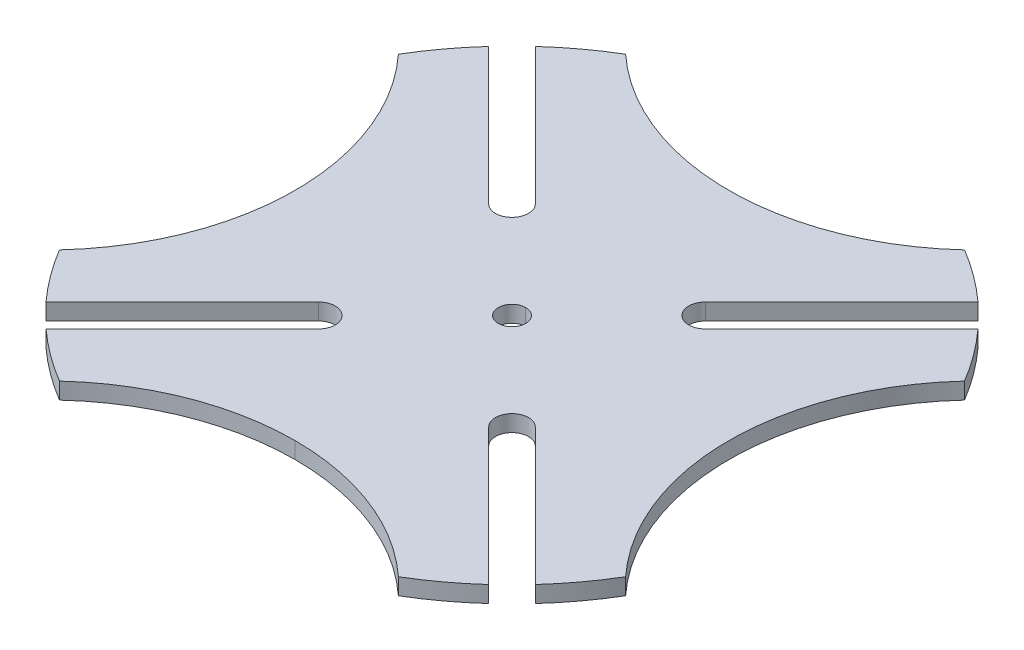
ISO-10303-21;
HEADER;
FILE_DESCRIPTION(('STEP AP214'),'2;1');
FILE_NAME('part.step','',(''),(''),'','','');
FILE_SCHEMA(('AUTOMOTIVE_DESIGN { 1 0 10303 214 1 1 1 1 }'));
ENDSEC;
DATA;
#1=APPLICATION_CONTEXT('core data for automotive mechanical design processes');
#2=APPLICATION_PROTOCOL_DEFINITION('international standard','automotive_design',2000,#1);
#3=PRODUCT_CONTEXT('',#1,'mechanical');
#4=PRODUCT('Part','Part','',(#3));
#5=PRODUCT_RELATED_PRODUCT_CATEGORY('part','',(#4));
#6=PRODUCT_DEFINITION_FORMATION('','',#4);
#7=PRODUCT_DEFINITION_CONTEXT('part definition',#1,'design');
#8=PRODUCT_DEFINITION('design','',#6,#7);
#9=PRODUCT_DEFINITION_SHAPE('','',#8);
#10=(LENGTH_UNIT() NAMED_UNIT(*) SI_UNIT(.MILLI.,.METRE.));
#11=(NAMED_UNIT(*) PLANE_ANGLE_UNIT() SI_UNIT($,.RADIAN.));
#12=(NAMED_UNIT(*) SI_UNIT($,.STERADIAN.) SOLID_ANGLE_UNIT());
#13=UNCERTAINTY_MEASURE_WITH_UNIT(LENGTH_MEASURE(1.E-05),#10,'distance_accuracy_value','');
#14=(GEOMETRIC_REPRESENTATION_CONTEXT(3) GLOBAL_UNCERTAINTY_ASSIGNED_CONTEXT((#13)) GLOBAL_UNIT_ASSIGNED_CONTEXT((#10,
#11,#12)) REPRESENTATION_CONTEXT('',''));
#15=CARTESIAN_POINT('',(0.,0.,0.));
#16=DIRECTION('',(0.,0.,1.));
#17=DIRECTION('',(1.,0.,0.));
#18=AXIS2_PLACEMENT_3D('',#15,#16,#17);
#19=CARTESIAN_POINT('',(0.,0.,0.));
#20=DIRECTION('',(0.,1.,0.));
#21=DIRECTION('',(0.,0.,1.));
#22=AXIS2_PLACEMENT_3D('',#19,#20,#21);
#23=CYLINDRICAL_SURFACE('',#22,2.5);
#24=DIRECTION('',(0.,1.,0.));
#25=VECTOR('',#24,1.);
#26=CARTESIAN_POINT('',(0.,0.,-2.5));
#27=LINE('',#26,#25);
#28=CARTESIAN_POINT('',(0.,0.,-2.5));
#29=VERTEX_POINT('',#28);
#30=CARTESIAN_POINT('',(0.,3.,-2.5));
#31=VERTEX_POINT('',#30);
#32=EDGE_CURVE('E313',#29,#31,#27,.T.);
#33=ORIENTED_EDGE('',*,*,#32,.F.);
#34=CARTESIAN_POINT('',(0.,0.,0.));
#35=DIRECTION('',(0.,1.,0.));
#36=DIRECTION('',(0.,0.,1.));
#37=AXIS2_PLACEMENT_3D('',#34,#35,#36);
#38=CIRCLE('',#37,2.5);
#39=CARTESIAN_POINT('',(0.,0.,2.5));
#40=VERTEX_POINT('',#39);
#41=EDGE_CURVE('E406',#40,#29,#38,.T.);
#42=ORIENTED_EDGE('',*,*,#41,.F.);
#43=DIRECTION('',(0.,1.,0.));
#44=VECTOR('',#43,1.);
#45=CARTESIAN_POINT('',(0.,0.,2.5));
#46=LINE('',#45,#44);
#47=CARTESIAN_POINT('',(0.,3.,2.5));
#48=VERTEX_POINT('',#47);
#49=EDGE_CURVE('E312',#40,#48,#46,.T.);
#50=ORIENTED_EDGE('',*,*,#49,.T.);
#51=CARTESIAN_POINT('',(0.,3.,0.));
#52=DIRECTION('',(0.,1.,0.));
#53=DIRECTION('',(0.,0.,1.));
#54=AXIS2_PLACEMENT_3D('',#51,#52,#53);
#55=CIRCLE('',#54,2.5);
#56=EDGE_CURVE('E19',#48,#31,#55,.T.);
#57=ORIENTED_EDGE('',*,*,#56,.T.);
#58=EDGE_LOOP('',(#33,#42,#50,#57));
#59=FACE_BOUND('',#58,.T.);
#60=ADVANCED_FACE('F15',(#59),#23,.F.);
#61=CARTESIAN_POINT('',(-17.5735931288072,0.,-17.5735931288051));
#62=DIRECTION('',(0.,1.,0.));
#63=DIRECTION('',(0.,0.,1.));
#64=AXIS2_PLACEMENT_3D('',#61,#62,#63);
#65=CYLINDRICAL_SURFACE('',#64,3.);
#66=DIRECTION('',(0.,1.,0.));
#67=VECTOR('',#66,1.);
#68=CARTESIAN_POINT('',(-17.5735931288072,0.,-14.573593128805));
#69=LINE('',#68,#67);
#70=CARTESIAN_POINT('',(-17.5735931288072,0.,-14.573593128805));
#71=VERTEX_POINT('',#70);
#72=CARTESIAN_POINT('',(-17.5735931288072,3.,-14.573593128805));
#73=VERTEX_POINT('',#72);
#74=EDGE_CURVE('E374',#71,#73,#69,.T.);
#75=ORIENTED_EDGE('',*,*,#74,.F.);
#76=CARTESIAN_POINT('',(-17.5735931288072,0.,-17.5735931288051));
#77=DIRECTION('',(0.,1.,0.));
#78=DIRECTION('',(0.,0.,1.));
#79=AXIS2_PLACEMENT_3D('',#76,#77,#78);
#80=CIRCLE('',#79,3.);
#81=CARTESIAN_POINT('',(-19.6949134723669,0.,-15.4522727852454));
#82=VERTEX_POINT('',#81);
#83=EDGE_CURVE('E409',#82,#71,#80,.T.);
#84=ORIENTED_EDGE('',*,*,#83,.F.);
#85=DIRECTION('',(0.,1.,0.));
#86=VECTOR('',#85,1.);
#87=CARTESIAN_POINT('',(-19.6949134723668,0.,-15.4522727852454));
#88=LINE('',#87,#86);
#89=CARTESIAN_POINT('',(-19.6949134723668,3.,-15.4522727852454));
#90=VERTEX_POINT('',#89);
#91=EDGE_CURVE('E9',#82,#90,#88,.T.);
#92=ORIENTED_EDGE('',*,*,#91,.T.);
#93=CARTESIAN_POINT('',(-17.5735931288072,3.,-17.5735931288051));
#94=DIRECTION('',(0.,1.,0.));
#95=DIRECTION('',(0.,0.,1.));
#96=AXIS2_PLACEMENT_3D('',#93,#94,#95);
#97=CIRCLE('',#96,3.);
#98=EDGE_CURVE('E446',#90,#73,#97,.T.);
#99=ORIENTED_EDGE('',*,*,#98,.T.);
#100=EDGE_LOOP('',(#75,#84,#92,#99));
#101=FACE_BOUND('',#100,.T.);
#102=ADVANCED_FACE('F628',(#101),#65,.F.);
#103=CARTESIAN_POINT('',(-44.5477272147523,0.,-40.3050865276311));
#104=DIRECTION('',(-0.707106781186551,0.,0.707106781186544));
#105=DIRECTION('',(0.,1.,0.));
#106=AXIS2_PLACEMENT_3D('',#103,#104,#105);
#107=PLANE('',#106);
#108=DIRECTION('',(0.707106781186544,0.,0.707106781186551));
#109=VECTOR('',#108,1.);
#110=CARTESIAN_POINT('',(-44.5477272147523,3.,-40.3050865276311));
#111=LINE('',#110,#109);
#112=CARTESIAN_POINT('',(-44.4946610190371,3.,-40.2520203319159));
#113=VERTEX_POINT('',#112);
#114=EDGE_CURVE('E443',#113,#90,#111,.T.);
#115=ORIENTED_EDGE('',*,*,#114,.T.);
#116=ORIENTED_EDGE('',*,*,#91,.F.);
#117=DIRECTION('',(-0.707106781186544,0.,-0.707106781186551));
#118=VECTOR('',#117,1.);
#119=CARTESIAN_POINT('',(19.0918830920352,0.,23.3345237791571));
#120=LINE('',#119,#118);
#121=CARTESIAN_POINT('',(-44.4946610190371,0.,-40.2520203319159));
#122=VERTEX_POINT('',#121);
#123=EDGE_CURVE('E412',#82,#122,#120,.T.);
#124=ORIENTED_EDGE('',*,*,#123,.T.);
#125=DIRECTION('',(0.,-1.,0.));
#126=VECTOR('',#125,1.);
#127=CARTESIAN_POINT('',(-44.4946610190371,3.,-40.2520203319159));
#128=LINE('',#127,#126);
#129=EDGE_CURVE('E465',#113,#122,#128,.T.);
#130=ORIENTED_EDGE('',*,*,#129,.F.);
#131=EDGE_LOOP('',(#115,#116,#124,#130));
#132=FACE_BOUND('',#131,.T.);
#133=ADVANCED_FACE('F630',(#132),#107,.F.);
#134=CARTESIAN_POINT('',(-40.3050865276329,0.,-44.5477272147504));
#135=DIRECTION('',(0.707106781186551,0.,-0.707106781186544));
#136=DIRECTION('',(0.,-1.,0.));
#137=AXIS2_PLACEMENT_3D('',#134,#135,#136);
#138=PLANE('',#137);
#139=DIRECTION('',(-0.707106781186544,0.,-0.707106781186551));
#140=VECTOR('',#139,1.);
#141=CARTESIAN_POINT('',(-40.3050865276329,0.,-44.5477272147504));
#142=LINE('',#141,#140);
#143=CARTESIAN_POINT('',(-15.4522727852476,0.,-19.6949134723647));
#144=VERTEX_POINT('',#143);
#145=CARTESIAN_POINT('',(-40.2520203319179,0.,-44.4946610190353));
#146=VERTEX_POINT('',#145);
#147=EDGE_CURVE('E268',#144,#146,#142,.T.);
#148=ORIENTED_EDGE('',*,*,#147,.F.);
#149=DIRECTION('',(0.,1.,0.));
#150=VECTOR('',#149,1.);
#151=CARTESIAN_POINT('',(-15.4522727852476,0.,-19.6949134723647));
#152=LINE('',#151,#150);
#153=CARTESIAN_POINT('',(-15.4522727852476,3.,-19.6949134723647));
#154=VERTEX_POINT('',#153);
#155=EDGE_CURVE('E541',#144,#154,#152,.T.);
#156=ORIENTED_EDGE('',*,*,#155,.T.);
#157=DIRECTION('',(-0.707106781186544,0.,-0.707106781186551));
#158=VECTOR('',#157,1.);
#159=CARTESIAN_POINT('',(-40.3050865276329,3.,-44.5477272147504));
#160=LINE('',#159,#158);
#161=CARTESIAN_POINT('',(-40.2520203319179,3.,-44.4946610190353));
#162=VERTEX_POINT('',#161);
#163=EDGE_CURVE('E330',#154,#162,#160,.T.);
#164=ORIENTED_EDGE('',*,*,#163,.T.);
#165=DIRECTION('',(0.,1.,0.));
#166=VECTOR('',#165,1.);
#167=CARTESIAN_POINT('',(-40.2520203319179,3.,-44.4946610190353));
#168=LINE('',#167,#166);
#169=EDGE_CURVE('E353',#146,#162,#168,.T.);
#170=ORIENTED_EDGE('',*,*,#169,.F.);
#171=EDGE_LOOP('',(#148,#156,#164,#170));
#172=FACE_BOUND('',#171,.T.);
#173=ADVANCED_FACE('F624',(#172),#138,.F.);
#174=CARTESIAN_POINT('',(-17.5735931288051,0.,17.5735931288096));
#175=DIRECTION('',(0.,1.,0.));
#176=DIRECTION('',(0.,0.,1.));
#177=AXIS2_PLACEMENT_3D('',#174,#175,#176);
#178=CYLINDRICAL_SURFACE('',#177,3.);
#179=CARTESIAN_POINT('',(-17.5735931288051,3.,17.5735931288096));
#180=DIRECTION('',(0.,1.,0.));
#181=DIRECTION('',(0.,0.,1.));
#182=AXIS2_PLACEMENT_3D('',#179,#180,#181);
#183=CIRCLE('',#182,3.);
#184=CARTESIAN_POINT('',(-15.4522727852454,3.,19.6949134723692));
#185=VERTEX_POINT('',#184);
#186=CARTESIAN_POINT('',(-19.6949134723647,3.,15.4522727852499));
#187=VERTEX_POINT('',#186);
#188=EDGE_CURVE('E401',#185,#187,#183,.T.);
#189=ORIENTED_EDGE('',*,*,#188,.T.);
#190=DIRECTION('',(0.,1.,0.));
#191=VECTOR('',#190,1.);
#192=CARTESIAN_POINT('',(-19.6949134723647,0.,15.4522727852499));
#193=LINE('',#192,#191);
#194=CARTESIAN_POINT('',(-19.6949134723647,0.,15.4522727852499));
#195=VERTEX_POINT('',#194);
#196=EDGE_CURVE('E413',#195,#187,#193,.T.);
#197=ORIENTED_EDGE('',*,*,#196,.F.);
#198=CARTESIAN_POINT('',(-17.5735931288051,0.,17.5735931288096));
#199=DIRECTION('',(0.,1.,0.));
#200=DIRECTION('',(0.,0.,1.));
#201=AXIS2_PLACEMENT_3D('',#198,#199,#200);
#202=CIRCLE('',#201,3.);
#203=CARTESIAN_POINT('',(-15.4522727852454,0.,19.6949134723692));
#204=VERTEX_POINT('',#203);
#205=EDGE_CURVE('E377',#204,#195,#202,.T.);
#206=ORIENTED_EDGE('',*,*,#205,.F.);
#207=DIRECTION('',(0.,1.,0.));
#208=VECTOR('',#207,1.);
#209=CARTESIAN_POINT('',(-15.4522727852454,0.,19.6949134723692));
#210=LINE('',#209,#208);
#211=EDGE_CURVE('E26',#204,#185,#210,.T.);
#212=ORIENTED_EDGE('',*,*,#211,.T.);
#213=EDGE_LOOP('',(#189,#197,#206,#212));
#214=FACE_BOUND('',#213,.T.);
#215=ADVANCED_FACE('F646',(#214),#178,.F.);
#216=CARTESIAN_POINT('',(-40.3050865276311,0.,44.5477272147546));
#217=DIRECTION('',(0.707106781186544,0.,0.707106781186552));
#218=DIRECTION('',(0.,-1.,0.));
#219=AXIS2_PLACEMENT_3D('',#216,#217,#218);
#220=PLANE('',#219);
#221=DIRECTION('',(0.707106781186552,0.,-0.707106781186544));
#222=VECTOR('',#221,1.);
#223=CARTESIAN_POINT('',(-40.3050865276311,3.,44.5477272147546));
#224=LINE('',#223,#222);
#225=CARTESIAN_POINT('',(-40.2520203319147,3.,44.4946610190382));
#226=VERTEX_POINT('',#225);
#227=EDGE_CURVE('E386',#226,#185,#224,.T.);
#228=ORIENTED_EDGE('',*,*,#227,.T.);
#229=ORIENTED_EDGE('',*,*,#211,.F.);
#230=DIRECTION('',(-0.707106781186552,0.,0.707106781186544));
#231=VECTOR('',#230,1.);
#232=CARTESIAN_POINT('',(23.3345237791585,0.,-19.0918830920343));
#233=LINE('',#232,#231);
#234=CARTESIAN_POINT('',(-40.2520203319147,0.,44.4946610190382));
#235=VERTEX_POINT('',#234);
#236=EDGE_CURVE('E382',#204,#235,#233,.T.);
#237=ORIENTED_EDGE('',*,*,#236,.T.);
#238=DIRECTION('',(0.,-1.,0.));
#239=VECTOR('',#238,1.);
#240=CARTESIAN_POINT('',(-40.2520203319147,3.,44.4946610190382));
#241=LINE('',#240,#239);
#242=EDGE_CURVE('E299',#226,#235,#241,.T.);
#243=ORIENTED_EDGE('',*,*,#242,.F.);
#244=EDGE_LOOP('',(#228,#229,#237,#243));
#245=FACE_BOUND('',#244,.T.);
#246=ADVANCED_FACE('F651',(#245),#220,.F.);
#247=CARTESIAN_POINT('',(-44.5477272147504,0.,40.3050865276353));
#248=DIRECTION('',(-0.707106781186544,0.,-0.707106781186551));
#249=DIRECTION('',(-0.707106781186551,0.,0.707106781186544));
#250=AXIS2_PLACEMENT_3D('',#247,#248,#249);
#251=PLANE('',#250);
#252=DIRECTION('',(-0.707106781186551,0.,0.707106781186544));
#253=VECTOR('',#252,1.);
#254=CARTESIAN_POINT('',(-44.5477272147504,0.,40.3050865276353));
#255=LINE('',#254,#253);
#256=CARTESIAN_POINT('',(-44.4946610190343,0.,40.2520203319192));
#257=VERTEX_POINT('',#256);
#258=EDGE_CURVE('E381',#195,#257,#255,.T.);
#259=ORIENTED_EDGE('',*,*,#258,.F.);
#260=ORIENTED_EDGE('',*,*,#196,.T.);
#261=DIRECTION('',(-0.707106781186551,0.,0.707106781186544));
#262=VECTOR('',#261,1.);
#263=CARTESIAN_POINT('',(-44.5477272147504,3.,40.3050865276353));
#264=LINE('',#263,#262);
#265=CARTESIAN_POINT('',(-44.4946610190343,3.,40.2520203319192));
#266=VERTEX_POINT('',#265);
#267=EDGE_CURVE('E405',#187,#266,#264,.T.);
#268=ORIENTED_EDGE('',*,*,#267,.T.);
#269=DIRECTION('',(0.,1.,0.));
#270=VECTOR('',#269,1.);
#271=CARTESIAN_POINT('',(-44.4946610190343,3.,40.2520203319192));
#272=LINE('',#271,#270);
#273=EDGE_CURVE('E452',#257,#266,#272,.T.);
#274=ORIENTED_EDGE('',*,*,#273,.F.);
#275=EDGE_LOOP('',(#259,#260,#268,#274));
#276=FACE_BOUND('',#275,.T.);
#277=ADVANCED_FACE('F643',(#276),#251,.F.);
#278=CARTESIAN_POINT('',(17.5735931288096,0.,17.5735931288074));
#279=DIRECTION('',(0.,1.,0.));
#280=DIRECTION('',(0.,0.,1.));
#281=AXIS2_PLACEMENT_3D('',#278,#279,#280);
#282=CYLINDRICAL_SURFACE('',#281,3.);
#283=CARTESIAN_POINT('',(17.5735931288096,3.,17.5735931288074));
#284=DIRECTION('',(0.,1.,0.));
#285=DIRECTION('',(0.,0.,1.));
#286=AXIS2_PLACEMENT_3D('',#283,#284,#285);
#287=CIRCLE('',#286,3.);
#288=CARTESIAN_POINT('',(19.6949134723692,3.,15.4522727852478));
#289=VERTEX_POINT('',#288);
#290=CARTESIAN_POINT('',(15.4522727852498,3.,19.694913472367));
#291=VERTEX_POINT('',#290);
#292=EDGE_CURVE('E369',#289,#291,#287,.T.);
#293=ORIENTED_EDGE('',*,*,#292,.T.);
#294=DIRECTION('',(0.,1.,0.));
#295=VECTOR('',#294,1.);
#296=CARTESIAN_POINT('',(15.4522727852498,0.,19.694913472367));
#297=LINE('',#296,#295);
#298=CARTESIAN_POINT('',(15.4522727852498,0.,19.694913472367));
#299=VERTEX_POINT('',#298);
#300=EDGE_CURVE('E483',#299,#291,#297,.T.);
#301=ORIENTED_EDGE('',*,*,#300,.F.);
#302=CARTESIAN_POINT('',(17.5735931288096,0.,17.5735931288074));
#303=DIRECTION('',(0.,1.,0.));
#304=DIRECTION('',(0.,0.,1.));
#305=AXIS2_PLACEMENT_3D('',#302,#303,#304);
#306=CIRCLE('',#305,3.);
#307=CARTESIAN_POINT('',(19.6949134723692,0.,15.4522727852478));
#308=VERTEX_POINT('',#307);
#309=EDGE_CURVE('E316',#308,#299,#306,.T.);
#310=ORIENTED_EDGE('',*,*,#309,.F.);
#311=DIRECTION('',(0.,1.,0.));
#312=VECTOR('',#311,1.);
#313=CARTESIAN_POINT('',(19.6949134723692,0.,15.4522727852478));
#314=LINE('',#313,#312);
#315=EDGE_CURVE('E416',#308,#289,#314,.T.);
#316=ORIENTED_EDGE('',*,*,#315,.T.);
#317=EDGE_LOOP('',(#293,#301,#310,#316));
#318=FACE_BOUND('',#317,.T.);
#319=ADVANCED_FACE('F703',(#318),#282,.F.);
#320=CARTESIAN_POINT('',(44.5477272147546,0.,40.3050865276334));
#321=DIRECTION('',(0.707106781186551,0.,-0.707106781186544));
#322=DIRECTION('',(0.,-1.,0.));
#323=AXIS2_PLACEMENT_3D('',#320,#321,#322);
#324=PLANE('',#323);
#325=DIRECTION('',(-0.707106781186544,0.,-0.707106781186551));
#326=VECTOR('',#325,1.);
#327=CARTESIAN_POINT('',(44.5477272147546,3.,40.3050865276334));
#328=LINE('',#327,#326);
#329=CARTESIAN_POINT('',(44.4946610190371,3.,40.2520203319159));
#330=VERTEX_POINT('',#329);
#331=EDGE_CURVE('E364',#330,#289,#328,.T.);
#332=ORIENTED_EDGE('',*,*,#331,.T.);
#333=ORIENTED_EDGE('',*,*,#315,.F.);
#334=DIRECTION('',(0.707106781186544,0.,0.707106781186551));
#335=VECTOR('',#334,1.);
#336=CARTESIAN_POINT('',(23.3345237791569,0.,19.0918830920355));
#337=LINE('',#336,#335);
#338=CARTESIAN_POINT('',(44.4946610190371,0.,40.2520203319159));
#339=VERTEX_POINT('',#338);
#340=EDGE_CURVE('E314',#308,#339,#337,.T.);
#341=ORIENTED_EDGE('',*,*,#340,.T.);
#342=DIRECTION('',(0.,-1.,0.));
#343=VECTOR('',#342,1.);
#344=CARTESIAN_POINT('',(44.4946610190371,3.,40.2520203319159));
#345=LINE('',#344,#343);
#346=EDGE_CURVE('E342',#330,#339,#345,.T.);
#347=ORIENTED_EDGE('',*,*,#346,.F.);
#348=EDGE_LOOP('',(#332,#333,#341,#347));
#349=FACE_BOUND('',#348,.T.);
#350=ADVANCED_FACE('F769',(#349),#324,.F.);
#351=CARTESIAN_POINT('',(40.3050865276353,0.,44.5477272147527));
#352=DIRECTION('',(-0.707106781186551,0.,0.707106781186544));
#353=DIRECTION('',(0.,1.,0.));
#354=AXIS2_PLACEMENT_3D('',#351,#352,#353);
#355=PLANE('',#354);
#356=DIRECTION('',(0.707106781186544,0.,0.707106781186551));
#357=VECTOR('',#356,1.);
#358=CARTESIAN_POINT('',(40.3050865276353,0.,44.5477272147527));
#359=LINE('',#358,#357);
#360=CARTESIAN_POINT('',(40.2520203319179,0.,44.4946610190353));
#361=VERTEX_POINT('',#360);
#362=EDGE_CURVE('E489',#299,#361,#359,.T.);
#363=ORIENTED_EDGE('',*,*,#362,.F.);
#364=ORIENTED_EDGE('',*,*,#300,.T.);
#365=DIRECTION('',(0.707106781186544,0.,0.707106781186551));
#366=VECTOR('',#365,1.);
#367=CARTESIAN_POINT('',(40.3050865276353,3.,44.5477272147527));
#368=LINE('',#367,#366);
#369=CARTESIAN_POINT('',(40.2520203319179,3.,44.4946610190353));
#370=VERTEX_POINT('',#369);
#371=EDGE_CURVE('E383',#291,#370,#368,.T.);
#372=ORIENTED_EDGE('',*,*,#371,.T.);
#373=DIRECTION('',(0.,1.,0.));
#374=VECTOR('',#373,1.);
#375=CARTESIAN_POINT('',(40.2520203319179,3.,44.4946610190353));
#376=LINE('',#375,#374);
#377=EDGE_CURVE('E460',#361,#370,#376,.T.);
#378=ORIENTED_EDGE('',*,*,#377,.F.);
#379=EDGE_LOOP('',(#363,#364,#372,#378));
#380=FACE_BOUND('',#379,.T.);
#381=ADVANCED_FACE('F586',(#380),#355,.F.);
#382=CARTESIAN_POINT('',(17.5735931288074,0.,-17.5735931288072));
#383=DIRECTION('',(0.,1.,0.));
#384=DIRECTION('',(0.,0.,1.));
#385=AXIS2_PLACEMENT_3D('',#382,#383,#384);
#386=CYLINDRICAL_SURFACE('',#385,3.);
#387=DIRECTION('',(0.,1.,0.));
#388=VECTOR('',#387,1.);
#389=CARTESIAN_POINT('',(17.5735931288074,0.,-14.5735931288072));
#390=LINE('',#389,#388);
#391=CARTESIAN_POINT('',(17.5735931288074,0.,-14.5735931288072));
#392=VERTEX_POINT('',#391);
#393=CARTESIAN_POINT('',(17.5735931288074,3.,-14.5735931288072));
#394=VERTEX_POINT('',#393);
#395=EDGE_CURVE('E352',#392,#394,#390,.T.);
#396=ORIENTED_EDGE('',*,*,#395,.F.);
#397=CARTESIAN_POINT('',(17.5735931288074,0.,-17.5735931288072));
#398=DIRECTION('',(0.,1.,0.));
#399=DIRECTION('',(0.,0.,1.));
#400=AXIS2_PLACEMENT_3D('',#397,#398,#399);
#401=CIRCLE('',#400,3.);
#402=CARTESIAN_POINT('',(15.4522727852478,0.,-19.6949134723668));
#403=VERTEX_POINT('',#402);
#404=EDGE_CURVE('E267',#403,#392,#401,.T.);
#405=ORIENTED_EDGE('',*,*,#404,.F.);
#406=DIRECTION('',(0.,1.,0.));
#407=VECTOR('',#406,1.);
#408=CARTESIAN_POINT('',(15.4522727852478,0.,-19.6949134723668));
#409=LINE('',#408,#407);
#410=CARTESIAN_POINT('',(15.4522727852478,3.,-19.6949134723668));
#411=VERTEX_POINT('',#410);
#412=EDGE_CURVE('E263',#403,#411,#409,.T.);
#413=ORIENTED_EDGE('',*,*,#412,.T.);
#414=CARTESIAN_POINT('',(17.5735931288074,3.,-17.5735931288072));
#415=DIRECTION('',(0.,1.,0.));
#416=DIRECTION('',(0.,0.,1.));
#417=AXIS2_PLACEMENT_3D('',#414,#415,#416);
#418=CIRCLE('',#417,3.);
#419=EDGE_CURVE('E424',#411,#394,#418,.T.);
#420=ORIENTED_EDGE('',*,*,#419,.T.);
#421=EDGE_LOOP('',(#396,#405,#413,#420));
#422=FACE_BOUND('',#421,.T.);
#423=ADVANCED_FACE('F768',(#422),#386,.F.);
#424=CARTESIAN_POINT('',(40.3050865276334,0.,-44.5477272147523));
#425=DIRECTION('',(-0.707106781186544,0.,-0.707106781186551));
#426=DIRECTION('',(-0.707106781186551,0.,0.707106781186544));
#427=AXIS2_PLACEMENT_3D('',#424,#425,#426);
#428=PLANE('',#427);
#429=DIRECTION('',(-0.707106781186551,0.,0.707106781186544));
#430=VECTOR('',#429,1.);
#431=CARTESIAN_POINT('',(40.3050865276334,3.,-44.5477272147523));
#432=LINE('',#431,#430);
#433=CARTESIAN_POINT('',(40.2520203319172,3.,-44.4946610190361));
#434=VERTEX_POINT('',#433);
#435=EDGE_CURVE('E425',#434,#411,#432,.T.);
#436=ORIENTED_EDGE('',*,*,#435,.T.);
#437=ORIENTED_EDGE('',*,*,#412,.F.);
#438=DIRECTION('',(0.707106781186551,0.,-0.707106781186544));
#439=VECTOR('',#438,1.);
#440=CARTESIAN_POINT('',(19.0918830920369,0.,-23.3345237791559));
#441=LINE('',#440,#439);
#442=CARTESIAN_POINT('',(40.2520203319172,0.,-44.4946610190361));
#443=VERTEX_POINT('',#442);
#444=EDGE_CURVE('E256',#403,#443,#441,.T.);
#445=ORIENTED_EDGE('',*,*,#444,.T.);
#446=DIRECTION('',(0.,-1.,0.));
#447=VECTOR('',#446,1.);
#448=CARTESIAN_POINT('',(40.2520203319172,3.,-44.4946610190361));
#449=LINE('',#448,#447);
#450=EDGE_CURVE('E261',#434,#443,#449,.T.);
#451=ORIENTED_EDGE('',*,*,#450,.F.);
#452=EDGE_LOOP('',(#436,#437,#445,#451));
#453=FACE_BOUND('',#452,.T.);
#454=ADVANCED_FACE('F259',(#453),#428,.F.);
#455=CARTESIAN_POINT('',(44.5477272147527,0.,-40.3050865276329));
#456=DIRECTION('',(0.707106781186544,0.,0.707106781186551));
#457=DIRECTION('',(0.,-1.,0.));
#458=AXIS2_PLACEMENT_3D('',#455,#456,#457);
#459=PLANE('',#458);
#460=DIRECTION('',(0.707106781186551,0.,-0.707106781186544));
#461=VECTOR('',#460,1.);
#462=CARTESIAN_POINT('',(44.5477272147527,0.,-40.3050865276329));
#463=LINE('',#462,#461);
#464=CARTESIAN_POINT('',(19.694913472367,0.,-15.4522727852476));
#465=VERTEX_POINT('',#464);
#466=CARTESIAN_POINT('',(44.4946610190364,0.,-40.2520203319167));
#467=VERTEX_POINT('',#466);
#468=EDGE_CURVE('E317',#465,#467,#463,.T.);
#469=ORIENTED_EDGE('',*,*,#468,.F.);
#470=DIRECTION('',(0.,1.,0.));
#471=VECTOR('',#470,1.);
#472=CARTESIAN_POINT('',(19.694913472367,0.,-15.4522727852476));
#473=LINE('',#472,#471);
#474=CARTESIAN_POINT('',(19.694913472367,3.,-15.4522727852476));
#475=VERTEX_POINT('',#474);
#476=EDGE_CURVE('E351',#465,#475,#473,.T.);
#477=ORIENTED_EDGE('',*,*,#476,.T.);
#478=DIRECTION('',(0.707106781186551,0.,-0.707106781186544));
#479=VECTOR('',#478,1.);
#480=CARTESIAN_POINT('',(44.5477272147527,3.,-40.3050865276329));
#481=LINE('',#480,#479);
#482=CARTESIAN_POINT('',(44.4946610190364,3.,-40.2520203319167));
#483=VERTEX_POINT('',#482);
#484=EDGE_CURVE('E368',#475,#483,#481,.T.);
#485=ORIENTED_EDGE('',*,*,#484,.T.);
#486=DIRECTION('',(0.,1.,0.));
#487=VECTOR('',#486,1.);
#488=CARTESIAN_POINT('',(44.4946610190364,3.,-40.2520203319167));
#489=LINE('',#488,#487);
#490=EDGE_CURVE('E438',#467,#483,#489,.T.);
#491=ORIENTED_EDGE('',*,*,#490,.F.);
#492=EDGE_LOOP('',(#469,#477,#485,#491));
#493=FACE_BOUND('',#492,.T.);
#494=ADVANCED_FACE('F740',(#493),#459,.F.);
#495=CARTESIAN_POINT('',(42.4264068711926,0.,0.));
#496=DIRECTION('',(0.,-1.,0.));
#497=DIRECTION('',(0.,0.,-1.));
#498=AXIS2_PLACEMENT_3D('',#495,#496,#497);
#499=PLANE('',#498);
#500=ORIENTED_EDGE('',*,*,#41,.T.);
#501=CARTESIAN_POINT('',(0.,0.,0.));
#502=DIRECTION('',(0.,1.,0.));
#503=DIRECTION('',(0.,0.,1.));
#504=AXIS2_PLACEMENT_3D('',#501,#502,#503);
#505=CIRCLE('',#504,2.5);
#506=EDGE_CURVE('E456',#29,#40,#505,.T.);
#507=ORIENTED_EDGE('',*,*,#506,.T.);
#508=EDGE_LOOP('',(#500,#507));
#509=FACE_BOUND('',#508,.T.);
#510=ORIENTED_EDGE('',*,*,#147,.T.);
#511=CARTESIAN_POINT('',(0.,0.,0.));
#512=DIRECTION('',(0.,1.,0.));
#513=DIRECTION('',(0.,0.,-1.));
#514=AXIS2_PLACEMENT_3D('',#511,#512,#513);
#515=CIRCLE('',#514,60.);
#516=CARTESIAN_POINT('',(-30.8190219546499,0.,-51.4799755804022));
#517=VERTEX_POINT('',#516);
#518=EDGE_CURVE('E306',#517,#146,#515,.T.);
#519=ORIENTED_EDGE('',*,*,#518,.F.);
#520=CARTESIAN_POINT('',(0.,0.,-84.8528137423853));
#521=DIRECTION('',(0.,-1.,0.));
#522=DIRECTION('',(0.,0.,1.));
#523=AXIS2_PLACEMENT_3D('',#520,#521,#522);
#524=CIRCLE('',#523,45.4264068711922);
#525=CARTESIAN_POINT('',(30.8190219546499,0.,-51.4799755804023));
#526=VERTEX_POINT('',#525);
#527=EDGE_CURVE('E274',#526,#517,#524,.T.);
#528=ORIENTED_EDGE('',*,*,#527,.F.);
#529=CARTESIAN_POINT('',(0.,0.,0.));
#530=DIRECTION('',(0.,1.,0.));
#531=DIRECTION('',(0.,0.,-1.));
#532=AXIS2_PLACEMENT_3D('',#529,#530,#531);
#533=CIRCLE('',#532,60.);
#534=EDGE_CURVE('E271',#443,#526,#533,.T.);
#535=ORIENTED_EDGE('',*,*,#534,.F.);
#536=ORIENTED_EDGE('',*,*,#444,.F.);
#537=ORIENTED_EDGE('',*,*,#404,.T.);
#538=CARTESIAN_POINT('',(17.5735931288074,0.,-17.5735931288072));
#539=DIRECTION('',(0.,1.,0.));
#540=DIRECTION('',(0.,0.,1.));
#541=AXIS2_PLACEMENT_3D('',#538,#539,#540);
#542=CIRCLE('',#541,3.);
#543=EDGE_CURVE('E537',#392,#465,#542,.T.);
#544=ORIENTED_EDGE('',*,*,#543,.T.);
#545=ORIENTED_EDGE('',*,*,#468,.T.);
#546=CARTESIAN_POINT('',(0.,0.,0.));
#547=DIRECTION('',(0.,1.,0.));
#548=DIRECTION('',(0.,0.,-1.));
#549=AXIS2_PLACEMENT_3D('',#546,#547,#548);
#550=CIRCLE('',#549,60.);
#551=CARTESIAN_POINT('',(51.4799755804023,0.,-30.8190219546499));
#552=VERTEX_POINT('',#551);
#553=EDGE_CURVE('E434',#552,#467,#550,.T.);
#554=ORIENTED_EDGE('',*,*,#553,.F.);
#555=CARTESIAN_POINT('',(84.8528137423853,0.,0.));
#556=DIRECTION('',(0.,-1.,0.));
#557=DIRECTION('',(0.,0.,1.));
#558=AXIS2_PLACEMENT_3D('',#555,#556,#557);
#559=CIRCLE('',#558,45.4264068711922);
#560=CARTESIAN_POINT('',(51.4799755804023,0.,30.8190219546498));
#561=VERTEX_POINT('',#560);
#562=EDGE_CURVE('E318',#561,#552,#559,.T.);
#563=ORIENTED_EDGE('',*,*,#562,.F.);
#564=CARTESIAN_POINT('',(0.,0.,0.));
#565=DIRECTION('',(0.,1.,0.));
#566=DIRECTION('',(0.,0.,-1.));
#567=AXIS2_PLACEMENT_3D('',#564,#565,#566);
#568=CIRCLE('',#567,60.);
#569=EDGE_CURVE('E333',#339,#561,#568,.T.);
#570=ORIENTED_EDGE('',*,*,#569,.F.);
#571=ORIENTED_EDGE('',*,*,#340,.F.);
#572=ORIENTED_EDGE('',*,*,#309,.T.);
#573=ORIENTED_EDGE('',*,*,#362,.T.);
#574=CARTESIAN_POINT('',(0.,0.,0.));
#575=DIRECTION('',(0.,1.,0.));
#576=DIRECTION('',(0.,0.,-1.));
#577=AXIS2_PLACEMENT_3D('',#574,#575,#576);
#578=CIRCLE('',#577,60.);
#579=CARTESIAN_POINT('',(30.8190219546498,0.,51.4799755804023));
#580=VERTEX_POINT('',#579);
#581=EDGE_CURVE('E346',#580,#361,#578,.T.);
#582=ORIENTED_EDGE('',*,*,#581,.F.);
#583=CARTESIAN_POINT('',(0.,0.,84.8528137423853));
#584=DIRECTION('',(0.,-1.,0.));
#585=DIRECTION('',(0.,0.,1.));
#586=AXIS2_PLACEMENT_3D('',#583,#584,#585);
#587=CIRCLE('',#586,45.4264068711922);
#588=CARTESIAN_POINT('',(0.,0.,39.4264068711931));
#589=VERTEX_POINT('',#588);
#590=EDGE_CURVE('E395',#589,#580,#587,.T.);
#591=ORIENTED_EDGE('',*,*,#590,.F.);
#592=CARTESIAN_POINT('',(0.,0.,84.8528137423853));
#593=DIRECTION('',(0.,-1.,0.));
#594=DIRECTION('',(0.,0.,1.));
#595=AXIS2_PLACEMENT_3D('',#592,#593,#594);
#596=CIRCLE('',#595,45.4264068711922);
#597=CARTESIAN_POINT('',(-30.8190219546498,0.,51.4799755804022));
#598=VERTEX_POINT('',#597);
#599=EDGE_CURVE('E295',#598,#589,#596,.T.);
#600=ORIENTED_EDGE('',*,*,#599,.F.);
#601=CARTESIAN_POINT('',(0.,0.,0.));
#602=DIRECTION('',(0.,1.,0.));
#603=DIRECTION('',(0.,0.,-1.));
#604=AXIS2_PLACEMENT_3D('',#601,#602,#603);
#605=CIRCLE('',#604,60.);
#606=EDGE_CURVE('E362',#235,#598,#605,.T.);
#607=ORIENTED_EDGE('',*,*,#606,.F.);
#608=ORIENTED_EDGE('',*,*,#236,.F.);
#609=ORIENTED_EDGE('',*,*,#205,.T.);
#610=ORIENTED_EDGE('',*,*,#258,.T.);
#611=CARTESIAN_POINT('',(0.,0.,0.));
#612=DIRECTION('',(0.,1.,0.));
#613=DIRECTION('',(0.,0.,-1.));
#614=AXIS2_PLACEMENT_3D('',#611,#612,#613);
#615=CIRCLE('',#614,60.);
#616=CARTESIAN_POINT('',(-51.4799755804022,0.,30.8190219546499));
#617=VERTEX_POINT('',#616);
#618=EDGE_CURVE('E482',#617,#257,#615,.T.);
#619=ORIENTED_EDGE('',*,*,#618,.F.);
#620=CARTESIAN_POINT('',(-84.8528137423853,0.,0.));
#621=DIRECTION('',(0.,-1.,0.));
#622=DIRECTION('',(0.,0.,1.));
#623=AXIS2_PLACEMENT_3D('',#620,#621,#622);
#624=CIRCLE('',#623,45.4264068711922);
#625=CARTESIAN_POINT('',(-51.4799755804023,0.,-30.8190219546498));
#626=VERTEX_POINT('',#625);
#627=EDGE_CURVE('E397',#626,#617,#624,.T.);
#628=ORIENTED_EDGE('',*,*,#627,.F.);
#629=CARTESIAN_POINT('',(0.,0.,0.));
#630=DIRECTION('',(0.,1.,0.));
#631=DIRECTION('',(0.,0.,-1.));
#632=AXIS2_PLACEMENT_3D('',#629,#630,#631);
#633=CIRCLE('',#632,60.);
#634=EDGE_CURVE('E461',#122,#626,#633,.T.);
#635=ORIENTED_EDGE('',*,*,#634,.F.);
#636=ORIENTED_EDGE('',*,*,#123,.F.);
#637=ORIENTED_EDGE('',*,*,#83,.T.);
#638=CARTESIAN_POINT('',(-17.5735931288072,0.,-17.5735931288051));
#639=DIRECTION('',(0.,1.,0.));
#640=DIRECTION('',(0.,0.,1.));
#641=AXIS2_PLACEMENT_3D('',#638,#639,#640);
#642=CIRCLE('',#641,3.);
#643=EDGE_CURVE('E370',#71,#144,#642,.T.);
#644=ORIENTED_EDGE('',*,*,#643,.T.);
#645=EDGE_LOOP('',(#510,#519,#528,#535,#536,#537,#544,#545,#554,#563,#570,#571,#572,#573,#582,
#591,#600,#607,#608,#609,#610,#619,#628,#635,#636,#637,#644));
#646=FACE_BOUND('',#645,.T.);
#647=ADVANCED_FACE('F272',(#509,#646),#499,.T.);
#648=CARTESIAN_POINT('',(42.4264068711926,3.,0.));
#649=DIRECTION('',(0.,-1.,0.));
#650=DIRECTION('',(0.,0.,-1.));
#651=AXIS2_PLACEMENT_3D('',#648,#649,#650);
#652=PLANE('',#651);
#653=ORIENTED_EDGE('',*,*,#56,.F.);
#654=CARTESIAN_POINT('',(0.,3.,0.));
#655=DIRECTION('',(0.,1.,0.));
#656=DIRECTION('',(0.,0.,1.));
#657=AXIS2_PLACEMENT_3D('',#654,#655,#656);
#658=CIRCLE('',#657,2.5);
#659=EDGE_CURVE('E308',#31,#48,#658,.T.);
#660=ORIENTED_EDGE('',*,*,#659,.F.);
#661=EDGE_LOOP('',(#653,#660));
#662=FACE_BOUND('',#661,.T.);
#663=CARTESIAN_POINT('',(0.,3.,0.));
#664=DIRECTION('',(0.,1.,0.));
#665=DIRECTION('',(0.,0.,-1.));
#666=AXIS2_PLACEMENT_3D('',#663,#664,#665);
#667=CIRCLE('',#666,60.);
#668=CARTESIAN_POINT('',(-30.8190219546499,3.,-51.4799755804022));
#669=VERTEX_POINT('',#668);
#670=EDGE_CURVE('E357',#669,#162,#667,.T.);
#671=ORIENTED_EDGE('',*,*,#670,.T.);
#672=ORIENTED_EDGE('',*,*,#163,.F.);
#673=CARTESIAN_POINT('',(-17.5735931288072,3.,-17.5735931288051));
#674=DIRECTION('',(0.,1.,0.));
#675=DIRECTION('',(0.,0.,1.));
#676=AXIS2_PLACEMENT_3D('',#673,#674,#675);
#677=CIRCLE('',#676,3.);
#678=EDGE_CURVE('E390',#73,#154,#677,.T.);
#679=ORIENTED_EDGE('',*,*,#678,.F.);
#680=ORIENTED_EDGE('',*,*,#98,.F.);
#681=ORIENTED_EDGE('',*,*,#114,.F.);
#682=CARTESIAN_POINT('',(0.,3.,0.));
#683=DIRECTION('',(0.,1.,0.));
#684=DIRECTION('',(0.,0.,-1.));
#685=AXIS2_PLACEMENT_3D('',#682,#683,#684);
#686=CIRCLE('',#685,60.);
#687=CARTESIAN_POINT('',(-51.4799755804023,3.,-30.8190219546498));
#688=VERTEX_POINT('',#687);
#689=EDGE_CURVE('E508',#113,#688,#686,.T.);
#690=ORIENTED_EDGE('',*,*,#689,.T.);
#691=CARTESIAN_POINT('',(-84.8528137423853,3.,0.));
#692=DIRECTION('',(0.,-1.,0.));
#693=DIRECTION('',(0.,0.,1.));
#694=AXIS2_PLACEMENT_3D('',#691,#692,#693);
#695=CIRCLE('',#694,45.4264068711922);
#696=CARTESIAN_POINT('',(-51.4799755804022,3.,30.8190219546499));
#697=VERTEX_POINT('',#696);
#698=EDGE_CURVE('E300',#688,#697,#695,.T.);
#699=ORIENTED_EDGE('',*,*,#698,.T.);
#700=CARTESIAN_POINT('',(0.,3.,0.));
#701=DIRECTION('',(0.,1.,0.));
#702=DIRECTION('',(0.,0.,-1.));
#703=AXIS2_PLACEMENT_3D('',#700,#701,#702);
#704=CIRCLE('',#703,60.);
#705=EDGE_CURVE('E447',#697,#266,#704,.T.);
#706=ORIENTED_EDGE('',*,*,#705,.T.);
#707=ORIENTED_EDGE('',*,*,#267,.F.);
#708=ORIENTED_EDGE('',*,*,#188,.F.);
#709=ORIENTED_EDGE('',*,*,#227,.F.);
#710=CARTESIAN_POINT('',(0.,3.,0.));
#711=DIRECTION('',(0.,1.,0.));
#712=DIRECTION('',(0.,0.,-1.));
#713=AXIS2_PLACEMENT_3D('',#710,#711,#712);
#714=CIRCLE('',#713,60.);
#715=CARTESIAN_POINT('',(-30.8190219546498,3.,51.4799755804022));
#716=VERTEX_POINT('',#715);
#717=EDGE_CURVE('E297',#226,#716,#714,.T.);
#718=ORIENTED_EDGE('',*,*,#717,.T.);
#719=CARTESIAN_POINT('',(0.,3.,84.8528137423853));
#720=DIRECTION('',(0.,-1.,0.));
#721=DIRECTION('',(0.,0.,1.));
#722=AXIS2_PLACEMENT_3D('',#719,#720,#721);
#723=CIRCLE('',#722,45.4264068711922);
#724=CARTESIAN_POINT('',(0.,3.,39.4264068711931));
#725=VERTEX_POINT('',#724);
#726=EDGE_CURVE('E361',#716,#725,#723,.T.);
#727=ORIENTED_EDGE('',*,*,#726,.T.);
#728=CARTESIAN_POINT('',(0.,3.,84.8528137423853));
#729=DIRECTION('',(0.,-1.,0.));
#730=DIRECTION('',(0.,0.,1.));
#731=AXIS2_PLACEMENT_3D('',#728,#729,#730);
#732=CIRCLE('',#731,45.4264068711922);
#733=CARTESIAN_POINT('',(30.8190219546498,3.,51.4799755804023));
#734=VERTEX_POINT('',#733);
#735=EDGE_CURVE('E396',#725,#734,#732,.T.);
#736=ORIENTED_EDGE('',*,*,#735,.T.);
#737=CARTESIAN_POINT('',(0.,3.,0.));
#738=DIRECTION('',(0.,1.,0.));
#739=DIRECTION('',(0.,0.,-1.));
#740=AXIS2_PLACEMENT_3D('',#737,#738,#739);
#741=CIRCLE('',#740,60.);
#742=EDGE_CURVE('E291',#734,#370,#741,.T.);
#743=ORIENTED_EDGE('',*,*,#742,.T.);
#744=ORIENTED_EDGE('',*,*,#371,.F.);
#745=ORIENTED_EDGE('',*,*,#292,.F.);
#746=ORIENTED_EDGE('',*,*,#331,.F.);
#747=CARTESIAN_POINT('',(0.,3.,0.));
#748=DIRECTION('',(0.,1.,0.));
#749=DIRECTION('',(0.,0.,-1.));
#750=AXIS2_PLACEMENT_3D('',#747,#748,#749);
#751=CIRCLE('',#750,60.);
#752=CARTESIAN_POINT('',(51.4799755804023,3.,30.8190219546498));
#753=VERTEX_POINT('',#752);
#754=EDGE_CURVE('E431',#330,#753,#751,.T.);
#755=ORIENTED_EDGE('',*,*,#754,.T.);
#756=CARTESIAN_POINT('',(84.8528137423853,3.,0.));
#757=DIRECTION('',(0.,-1.,0.));
#758=DIRECTION('',(0.,0.,1.));
#759=AXIS2_PLACEMENT_3D('',#756,#757,#758);
#760=CIRCLE('',#759,45.4264068711922);
#761=CARTESIAN_POINT('',(51.4799755804023,3.,-30.8190219546499));
#762=VERTEX_POINT('',#761);
#763=EDGE_CURVE('E320',#753,#762,#760,.T.);
#764=ORIENTED_EDGE('',*,*,#763,.T.);
#765=CARTESIAN_POINT('',(0.,3.,0.));
#766=DIRECTION('',(0.,1.,0.));
#767=DIRECTION('',(0.,0.,-1.));
#768=AXIS2_PLACEMENT_3D('',#765,#766,#767);
#769=CIRCLE('',#768,60.);
#770=EDGE_CURVE('E307',#762,#483,#769,.T.);
#771=ORIENTED_EDGE('',*,*,#770,.T.);
#772=ORIENTED_EDGE('',*,*,#484,.F.);
#773=CARTESIAN_POINT('',(17.5735931288074,3.,-17.5735931288072));
#774=DIRECTION('',(0.,1.,0.));
#775=DIRECTION('',(0.,0.,1.));
#776=AXIS2_PLACEMENT_3D('',#773,#774,#775);
#777=CIRCLE('',#776,3.);
#778=EDGE_CURVE('E348',#394,#475,#777,.T.);
#779=ORIENTED_EDGE('',*,*,#778,.F.);
#780=ORIENTED_EDGE('',*,*,#419,.F.);
#781=ORIENTED_EDGE('',*,*,#435,.F.);
#782=CARTESIAN_POINT('',(0.,3.,0.));
#783=DIRECTION('',(0.,1.,0.));
#784=DIRECTION('',(0.,0.,-1.));
#785=AXIS2_PLACEMENT_3D('',#782,#783,#784);
#786=CIRCLE('',#785,60.);
#787=CARTESIAN_POINT('',(30.8190219546499,3.,-51.4799755804023));
#788=VERTEX_POINT('',#787);
#789=EDGE_CURVE('E283',#434,#788,#786,.T.);
#790=ORIENTED_EDGE('',*,*,#789,.T.);
#791=CARTESIAN_POINT('',(0.,3.,-84.8528137423853));
#792=DIRECTION('',(0.,-1.,0.));
#793=DIRECTION('',(0.,0.,1.));
#794=AXIS2_PLACEMENT_3D('',#791,#792,#793);
#795=CIRCLE('',#794,45.4264068711922);
#796=EDGE_CURVE('E505',#788,#669,#795,.T.);
#797=ORIENTED_EDGE('',*,*,#796,.T.);
#798=EDGE_LOOP('',(#671,#672,#679,#680,#681,#690,#699,#706,#707,#708,#709,#718,#727,#736,#743,
#744,#745,#746,#755,#764,#771,#772,#779,#780,#781,#790,#797));
#799=FACE_BOUND('',#798,.T.);
#800=ADVANCED_FACE('F591',(#662,#799),#652,.F.);
#801=CARTESIAN_POINT('',(84.8528137423853,3.,0.));
#802=DIRECTION('',(0.,-1.,0.));
#803=DIRECTION('',(0.,0.,-1.));
#804=AXIS2_PLACEMENT_3D('',#801,#802,#803);
#805=CYLINDRICAL_SURFACE('',#804,45.4264068711922);
#806=ORIENTED_EDGE('',*,*,#562,.T.);
#807=DIRECTION('',(0.,-1.,0.));
#808=VECTOR('',#807,1.);
#809=CARTESIAN_POINT('',(51.4799755804023,3.,-30.8190219546499));
#810=LINE('',#809,#808);
#811=EDGE_CURVE('E302',#762,#552,#810,.T.);
#812=ORIENTED_EDGE('',*,*,#811,.F.);
#813=ORIENTED_EDGE('',*,*,#763,.F.);
#814=DIRECTION('',(0.,-1.,0.));
#815=VECTOR('',#814,1.);
#816=CARTESIAN_POINT('',(51.4799755804023,3.,30.8190219546498));
#817=LINE('',#816,#815);
#818=EDGE_CURVE('E321',#753,#561,#817,.T.);
#819=ORIENTED_EDGE('',*,*,#818,.T.);
#820=EDGE_LOOP('',(#806,#812,#813,#819));
#821=FACE_BOUND('',#820,.T.);
#822=ADVANCED_FACE('F734',(#821),#805,.F.);
#823=CARTESIAN_POINT('',(0.,3.,0.));
#824=DIRECTION('',(0.,-1.,0.));
#825=DIRECTION('',(0.,0.,-1.));
#826=AXIS2_PLACEMENT_3D('',#823,#824,#825);
#827=CYLINDRICAL_SURFACE('',#826,60.);
#828=ORIENTED_EDGE('',*,*,#754,.F.);
#829=ORIENTED_EDGE('',*,*,#346,.T.);
#830=ORIENTED_EDGE('',*,*,#569,.T.);
#831=ORIENTED_EDGE('',*,*,#818,.F.);
#832=EDGE_LOOP('',(#828,#829,#830,#831));
#833=FACE_BOUND('',#832,.T.);
#834=ADVANCED_FACE('F752',(#833),#827,.T.);
#835=CARTESIAN_POINT('',(0.,3.,84.8528137423853));
#836=DIRECTION('',(0.,-1.,0.));
#837=DIRECTION('',(0.,0.,-1.));
#838=AXIS2_PLACEMENT_3D('',#835,#836,#837);
#839=CYLINDRICAL_SURFACE('',#838,45.4264068711922);
#840=DIRECTION('',(0.,-1.,0.));
#841=VECTOR('',#840,1.);
#842=CARTESIAN_POINT('',(0.,3.,39.4264068711931));
#843=LINE('',#842,#841);
#844=EDGE_CURVE('E391',#725,#589,#843,.T.);
#845=ORIENTED_EDGE('',*,*,#844,.F.);
#846=ORIENTED_EDGE('',*,*,#726,.F.);
#847=DIRECTION('',(0.,-1.,0.));
#848=VECTOR('',#847,1.);
#849=CARTESIAN_POINT('',(-30.8190219546498,3.,51.4799755804022));
#850=LINE('',#849,#848);
#851=EDGE_CURVE('E358',#716,#598,#850,.T.);
#852=ORIENTED_EDGE('',*,*,#851,.T.);
#853=ORIENTED_EDGE('',*,*,#599,.T.);
#854=EDGE_LOOP('',(#845,#846,#852,#853));
#855=FACE_BOUND('',#854,.T.);
#856=ADVANCED_FACE('F658',(#855),#839,.F.);
#857=CARTESIAN_POINT('',(0.,3.,0.));
#858=DIRECTION('',(0.,-1.,0.));
#859=DIRECTION('',(0.,0.,-1.));
#860=AXIS2_PLACEMENT_3D('',#857,#858,#859);
#861=CYLINDRICAL_SURFACE('',#860,60.);
#862=ORIENTED_EDGE('',*,*,#717,.F.);
#863=ORIENTED_EDGE('',*,*,#242,.T.);
#864=ORIENTED_EDGE('',*,*,#606,.T.);
#865=ORIENTED_EDGE('',*,*,#851,.F.);
#866=EDGE_LOOP('',(#862,#863,#864,#865));
#867=FACE_BOUND('',#866,.T.);
#868=ADVANCED_FACE('F655',(#867),#861,.T.);
#869=CARTESIAN_POINT('',(-84.8528137423853,3.,0.));
#870=DIRECTION('',(0.,-1.,0.));
#871=DIRECTION('',(0.,0.,-1.));
#872=AXIS2_PLACEMENT_3D('',#869,#870,#871);
#873=CYLINDRICAL_SURFACE('',#872,45.4264068711922);
#874=ORIENTED_EDGE('',*,*,#627,.T.);
#875=DIRECTION('',(0.,-1.,0.));
#876=VECTOR('',#875,1.);
#877=CARTESIAN_POINT('',(-51.4799755804022,3.,30.8190219546499));
#878=LINE('',#877,#876);
#879=EDGE_CURVE('E451',#697,#617,#878,.T.);
#880=ORIENTED_EDGE('',*,*,#879,.F.);
#881=ORIENTED_EDGE('',*,*,#698,.F.);
#882=DIRECTION('',(0.,-1.,0.));
#883=VECTOR('',#882,1.);
#884=CARTESIAN_POINT('',(-51.4799755804023,3.,-30.8190219546498));
#885=LINE('',#884,#883);
#886=EDGE_CURVE('E400',#688,#626,#885,.T.);
#887=ORIENTED_EDGE('',*,*,#886,.T.);
#888=EDGE_LOOP('',(#874,#880,#881,#887));
#889=FACE_BOUND('',#888,.T.);
#890=ADVANCED_FACE('F636',(#889),#873,.F.);
#891=CARTESIAN_POINT('',(0.,3.,0.));
#892=DIRECTION('',(0.,-1.,0.));
#893=DIRECTION('',(0.,0.,-1.));
#894=AXIS2_PLACEMENT_3D('',#891,#892,#893);
#895=CYLINDRICAL_SURFACE('',#894,60.);
#896=ORIENTED_EDGE('',*,*,#689,.F.);
#897=ORIENTED_EDGE('',*,*,#129,.T.);
#898=ORIENTED_EDGE('',*,*,#634,.T.);
#899=ORIENTED_EDGE('',*,*,#886,.F.);
#900=EDGE_LOOP('',(#896,#897,#898,#899));
#901=FACE_BOUND('',#900,.T.);
#902=ADVANCED_FACE('F634',(#901),#895,.T.);
#903=CARTESIAN_POINT('',(0.,3.,-84.8528137423853));
#904=DIRECTION('',(0.,-1.,0.));
#905=DIRECTION('',(0.,0.,-1.));
#906=AXIS2_PLACEMENT_3D('',#903,#904,#905);
#907=CYLINDRICAL_SURFACE('',#906,45.4264068711922);
#908=ORIENTED_EDGE('',*,*,#527,.T.);
#909=DIRECTION('',(0.,-1.,0.));
#910=VECTOR('',#909,1.);
#911=CARTESIAN_POINT('',(-30.8190219546499,3.,-51.4799755804022));
#912=LINE('',#911,#910);
#913=EDGE_CURVE('E478',#669,#517,#912,.T.);
#914=ORIENTED_EDGE('',*,*,#913,.F.);
#915=ORIENTED_EDGE('',*,*,#796,.F.);
#916=DIRECTION('',(0.,-1.,0.));
#917=VECTOR('',#916,1.);
#918=CARTESIAN_POINT('',(30.8190219546499,3.,-51.4799755804023));
#919=LINE('',#918,#917);
#920=EDGE_CURVE('E279',#788,#526,#919,.T.);
#921=ORIENTED_EDGE('',*,*,#920,.T.);
#922=EDGE_LOOP('',(#908,#914,#915,#921));
#923=FACE_BOUND('',#922,.T.);
#924=ADVANCED_FACE('F708',(#923),#907,.F.);
#925=CARTESIAN_POINT('',(0.,3.,0.));
#926=DIRECTION('',(0.,-1.,0.));
#927=DIRECTION('',(0.,0.,-1.));
#928=AXIS2_PLACEMENT_3D('',#925,#926,#927);
#929=CYLINDRICAL_SURFACE('',#928,60.);
#930=ORIENTED_EDGE('',*,*,#789,.F.);
#931=ORIENTED_EDGE('',*,*,#450,.T.);
#932=ORIENTED_EDGE('',*,*,#534,.T.);
#933=ORIENTED_EDGE('',*,*,#920,.F.);
#934=EDGE_LOOP('',(#930,#931,#932,#933));
#935=FACE_BOUND('',#934,.T.);
#936=ADVANCED_FACE('F281',(#935),#929,.T.);
#937=CARTESIAN_POINT('',(0.,3.,0.));
#938=DIRECTION('',(0.,-1.,0.));
#939=DIRECTION('',(0.,0.,-1.));
#940=AXIS2_PLACEMENT_3D('',#937,#938,#939);
#941=CYLINDRICAL_SURFACE('',#940,60.);
#942=ORIENTED_EDGE('',*,*,#581,.T.);
#943=ORIENTED_EDGE('',*,*,#377,.T.);
#944=ORIENTED_EDGE('',*,*,#742,.F.);
#945=DIRECTION('',(0.,-1.,0.));
#946=VECTOR('',#945,1.);
#947=CARTESIAN_POINT('',(30.8190219546498,3.,51.4799755804023));
#948=LINE('',#947,#946);
#949=EDGE_CURVE('E439',#734,#580,#948,.T.);
#950=ORIENTED_EDGE('',*,*,#949,.T.);
#951=EDGE_LOOP('',(#942,#943,#944,#950));
#952=FACE_BOUND('',#951,.T.);
#953=ADVANCED_FACE('F17',(#952),#941,.T.);
#954=CARTESIAN_POINT('',(0.,3.,0.));
#955=DIRECTION('',(0.,-1.,0.));
#956=DIRECTION('',(0.,0.,-1.));
#957=AXIS2_PLACEMENT_3D('',#954,#955,#956);
#958=CYLINDRICAL_SURFACE('',#957,60.);
#959=ORIENTED_EDGE('',*,*,#618,.T.);
#960=ORIENTED_EDGE('',*,*,#273,.T.);
#961=ORIENTED_EDGE('',*,*,#705,.F.);
#962=ORIENTED_EDGE('',*,*,#879,.T.);
#963=EDGE_LOOP('',(#959,#960,#961,#962));
#964=FACE_BOUND('',#963,.T.);
#965=ADVANCED_FACE('F637',(#964),#958,.T.);
#966=CARTESIAN_POINT('',(0.,3.,0.));
#967=DIRECTION('',(0.,-1.,0.));
#968=DIRECTION('',(0.,0.,-1.));
#969=AXIS2_PLACEMENT_3D('',#966,#967,#968);
#970=CYLINDRICAL_SURFACE('',#969,60.);
#971=ORIENTED_EDGE('',*,*,#518,.T.);
#972=ORIENTED_EDGE('',*,*,#169,.T.);
#973=ORIENTED_EDGE('',*,*,#670,.F.);
#974=ORIENTED_EDGE('',*,*,#913,.T.);
#975=EDGE_LOOP('',(#971,#972,#973,#974));
#976=FACE_BOUND('',#975,.T.);
#977=ADVANCED_FACE('F777',(#976),#970,.T.);
#978=CARTESIAN_POINT('',(0.,3.,0.));
#979=DIRECTION('',(0.,-1.,0.));
#980=DIRECTION('',(0.,0.,-1.));
#981=AXIS2_PLACEMENT_3D('',#978,#979,#980);
#982=CYLINDRICAL_SURFACE('',#981,60.);
#983=ORIENTED_EDGE('',*,*,#553,.T.);
#984=ORIENTED_EDGE('',*,*,#490,.T.);
#985=ORIENTED_EDGE('',*,*,#770,.F.);
#986=ORIENTED_EDGE('',*,*,#811,.T.);
#987=EDGE_LOOP('',(#983,#984,#985,#986));
#988=FACE_BOUND('',#987,.T.);
#989=ADVANCED_FACE('F695',(#988),#982,.T.);
#990=CARTESIAN_POINT('',(0.,3.,84.8528137423853));
#991=DIRECTION('',(0.,-1.,0.));
#992=DIRECTION('',(0.,0.,-1.));
#993=AXIS2_PLACEMENT_3D('',#990,#991,#992);
#994=CYLINDRICAL_SURFACE('',#993,45.4264068711922);
#995=ORIENTED_EDGE('',*,*,#735,.F.);
#996=ORIENTED_EDGE('',*,*,#844,.T.);
#997=ORIENTED_EDGE('',*,*,#590,.T.);
#998=ORIENTED_EDGE('',*,*,#949,.F.);
#999=EDGE_LOOP('',(#995,#996,#997,#998));
#1000=FACE_BOUND('',#999,.T.);
#1001=ADVANCED_FACE('F594',(#1000),#994,.F.);
#1002=CARTESIAN_POINT('',(17.5735931288074,0.,-17.5735931288072));
#1003=DIRECTION('',(0.,1.,0.));
#1004=DIRECTION('',(0.,0.,1.));
#1005=AXIS2_PLACEMENT_3D('',#1002,#1003,#1004);
#1006=CYLINDRICAL_SURFACE('',#1005,3.);
#1007=ORIENTED_EDGE('',*,*,#543,.F.);
#1008=ORIENTED_EDGE('',*,*,#395,.T.);
#1009=ORIENTED_EDGE('',*,*,#778,.T.);
#1010=ORIENTED_EDGE('',*,*,#476,.F.);
#1011=EDGE_LOOP('',(#1007,#1008,#1009,#1010));
#1012=FACE_BOUND('',#1011,.T.);
#1013=ADVANCED_FACE('F694',(#1012),#1006,.F.);
#1014=CARTESIAN_POINT('',(-17.5735931288072,0.,-17.5735931288051));
#1015=DIRECTION('',(0.,1.,0.));
#1016=DIRECTION('',(0.,0.,1.));
#1017=AXIS2_PLACEMENT_3D('',#1014,#1015,#1016);
#1018=CYLINDRICAL_SURFACE('',#1017,3.);
#1019=ORIENTED_EDGE('',*,*,#643,.F.);
#1020=ORIENTED_EDGE('',*,*,#74,.T.);
#1021=ORIENTED_EDGE('',*,*,#678,.T.);
#1022=ORIENTED_EDGE('',*,*,#155,.F.);
#1023=EDGE_LOOP('',(#1019,#1020,#1021,#1022));
#1024=FACE_BOUND('',#1023,.T.);
#1025=ADVANCED_FACE('F618',(#1024),#1018,.F.);
#1026=CARTESIAN_POINT('',(0.,0.,0.));
#1027=DIRECTION('',(0.,1.,0.));
#1028=DIRECTION('',(0.,0.,1.));
#1029=AXIS2_PLACEMENT_3D('',#1026,#1027,#1028);
#1030=CYLINDRICAL_SURFACE('',#1029,2.5);
#1031=ORIENTED_EDGE('',*,*,#506,.F.);
#1032=ORIENTED_EDGE('',*,*,#32,.T.);
#1033=ORIENTED_EDGE('',*,*,#659,.T.);
#1034=ORIENTED_EDGE('',*,*,#49,.F.);
#1035=EDGE_LOOP('',(#1031,#1032,#1033,#1034));
#1036=FACE_BOUND('',#1035,.T.);
#1037=ADVANCED_FACE('F760',(#1036),#1030,.F.);
#1038=CLOSED_SHELL('',(#60,#102,#133,#173,#215,#246,#277,#319,#350,#381,#423,#454,#494,#647,
#800,#822,#834,#856,#868,#890,#902,#924,#936,#953,#965,#977,#989,#1001,#1013,#1025,#1037));
#1039=MANIFOLD_SOLID_BREP('B1',#1038);
#1040=ADVANCED_BREP_SHAPE_REPRESENTATION('',(#18,#1039),#14);
#1041=SHAPE_DEFINITION_REPRESENTATION(#9,#1040);
ENDSEC;
END-ISO-10303-21;
